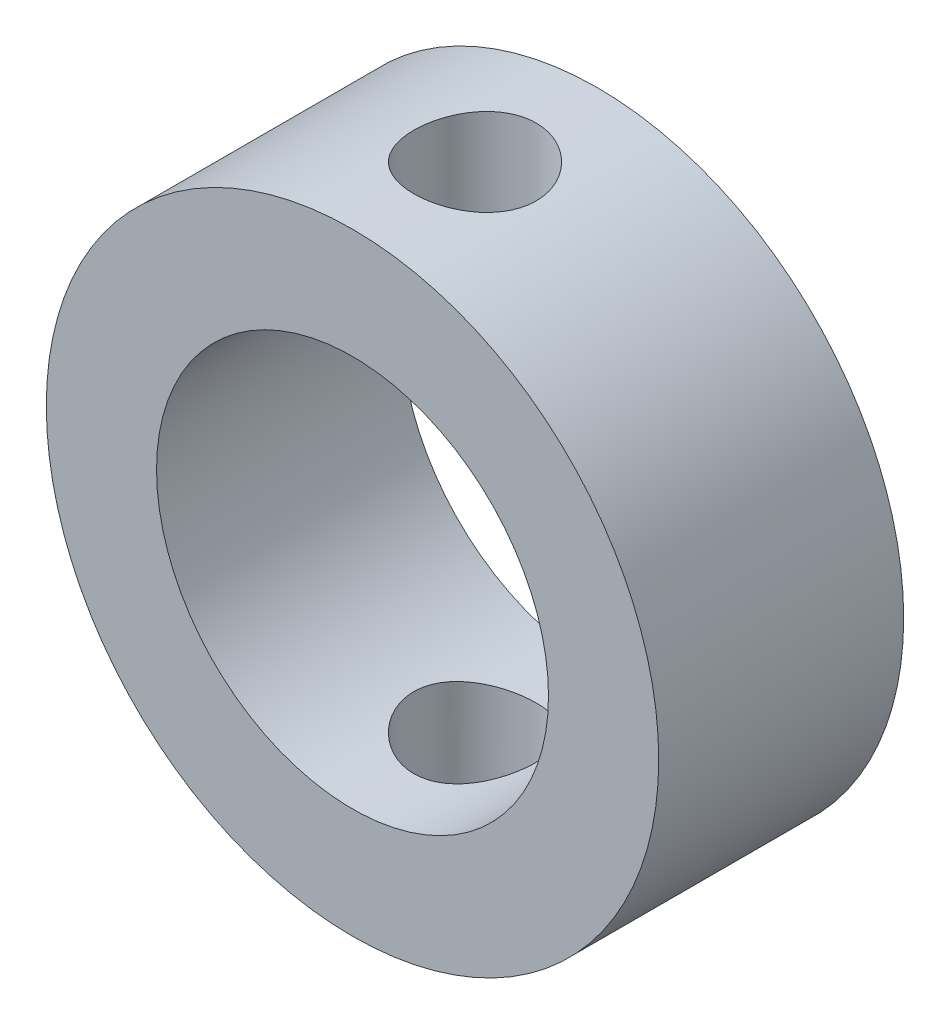
ISO-10303-21;
HEADER;
FILE_DESCRIPTION(('STEP AP214'),'2;1');
FILE_NAME('part.step','',(''),(''),'','','');
FILE_SCHEMA(('AUTOMOTIVE_DESIGN { 1 0 10303 214 1 1 1 1 }'));
ENDSEC;
DATA;
#1=APPLICATION_CONTEXT('core data for automotive mechanical design processes');
#2=APPLICATION_PROTOCOL_DEFINITION('international standard','automotive_design',2000,#1);
#3=PRODUCT_CONTEXT('',#1,'mechanical');
#4=PRODUCT('Part','Part','',(#3));
#5=PRODUCT_RELATED_PRODUCT_CATEGORY('part','',(#4));
#6=PRODUCT_DEFINITION_FORMATION('','',#4);
#7=PRODUCT_DEFINITION_CONTEXT('part definition',#1,'design');
#8=PRODUCT_DEFINITION('design','',#6,#7);
#9=PRODUCT_DEFINITION_SHAPE('','',#8);
#10=(LENGTH_UNIT() NAMED_UNIT(*) SI_UNIT(.MILLI.,.METRE.));
#11=(NAMED_UNIT(*) PLANE_ANGLE_UNIT() SI_UNIT($,.RADIAN.));
#12=(NAMED_UNIT(*) SI_UNIT($,.STERADIAN.) SOLID_ANGLE_UNIT());
#13=UNCERTAINTY_MEASURE_WITH_UNIT(LENGTH_MEASURE(1.E-05),#10,'distance_accuracy_value','');
#14=(GEOMETRIC_REPRESENTATION_CONTEXT(3) GLOBAL_UNCERTAINTY_ASSIGNED_CONTEXT((#13)) GLOBAL_UNIT_ASSIGNED_CONTEXT((#10,
#11,#12)) REPRESENTATION_CONTEXT('',''));
#15=CARTESIAN_POINT('',(0.,0.,0.));
#16=DIRECTION('',(0.,0.,1.));
#17=DIRECTION('',(1.,0.,0.));
#18=AXIS2_PLACEMENT_3D('',#15,#16,#17);
#19=CARTESIAN_POINT('',(0.,0.,10.));
#20=DIRECTION('',(0.,0.,1.));
#21=DIRECTION('',(1.,0.,0.));
#22=AXIS2_PLACEMENT_3D('',#19,#20,#21);
#23=PLANE('',#22);
#24=CARTESIAN_POINT('',(0.,0.,10.));
#25=DIRECTION('',(0.,0.,1.));
#26=DIRECTION('',(1.,0.,0.));
#27=AXIS2_PLACEMENT_3D('',#24,#25,#26);
#28=CIRCLE('',#27,12.5);
#29=CARTESIAN_POINT('',(12.5,0.,10.));
#30=VERTEX_POINT('',#29);
#31=EDGE_CURVE('E10',#30,#30,#28,.T.);
#32=ORIENTED_EDGE('',*,*,#31,.T.);
#33=EDGE_LOOP('',(#32));
#34=FACE_BOUND('',#33,.T.);
#35=CARTESIAN_POINT('',(0.,0.,10.));
#36=DIRECTION('',(0.,0.,1.));
#37=DIRECTION('',(1.,0.,0.));
#38=AXIS2_PLACEMENT_3D('',#35,#36,#37);
#39=CIRCLE('',#38,8.);
#40=CARTESIAN_POINT('',(8.,0.,10.));
#41=VERTEX_POINT('',#40);
#42=EDGE_CURVE('E50',#41,#41,#39,.T.);
#43=ORIENTED_EDGE('',*,*,#42,.F.);
#44=EDGE_LOOP('',(#43));
#45=FACE_BOUND('',#44,.T.);
#46=ADVANCED_FACE('F31',(#34,#45),#23,.T.);
#47=CARTESIAN_POINT('',(0.,0.,0.));
#48=DIRECTION('',(0.,0.,1.));
#49=DIRECTION('',(1.,0.,0.));
#50=AXIS2_PLACEMENT_3D('',#47,#48,#49);
#51=PLANE('',#50);
#52=CARTESIAN_POINT('',(0.,0.,0.));
#53=DIRECTION('',(0.,0.,1.));
#54=DIRECTION('',(1.,0.,0.));
#55=AXIS2_PLACEMENT_3D('',#52,#53,#54);
#56=CIRCLE('',#55,12.5);
#57=CARTESIAN_POINT('',(12.5,0.,0.));
#58=VERTEX_POINT('',#57);
#59=EDGE_CURVE('E45',#58,#58,#56,.T.);
#60=ORIENTED_EDGE('',*,*,#59,.F.);
#61=EDGE_LOOP('',(#60));
#62=FACE_BOUND('',#61,.T.);
#63=CARTESIAN_POINT('',(0.,0.,0.));
#64=DIRECTION('',(0.,0.,1.));
#65=DIRECTION('',(1.,0.,0.));
#66=AXIS2_PLACEMENT_3D('',#63,#64,#65);
#67=CIRCLE('',#66,8.);
#68=CARTESIAN_POINT('',(8.,0.,0.));
#69=VERTEX_POINT('',#68);
#70=EDGE_CURVE('E53',#69,#69,#67,.T.);
#71=ORIENTED_EDGE('',*,*,#70,.T.);
#72=EDGE_LOOP('',(#71));
#73=FACE_BOUND('',#72,.T.);
#74=ADVANCED_FACE('F89',(#62,#73),#51,.F.);
#75=CARTESIAN_POINT('',(0.,0.,10.));
#76=DIRECTION('',(0.,0.,-1.));
#77=DIRECTION('',(-1.,0.,0.));
#78=AXIS2_PLACEMENT_3D('',#75,#76,#77);
#79=CYLINDRICAL_SURFACE('',#78,12.5);
#80=CARTESIAN_POINT('',(0.,-12.5,7.5));
#81=CARTESIAN_POINT('',(0.138942266981583,-12.4999974395218,7.49999488875414));
#82=CARTESIAN_POINT('',(0.277949150503806,-12.4976596294558,7.48837789258089));
#83=CARTESIAN_POINT('',(0.552033769222549,-12.4885591405808,7.44225374971189));
#84=CARTESIAN_POINT('',(0.68710829385339,-12.4817929465047,7.40772841799623));
#85=CARTESIAN_POINT('',(0.949325763158283,-12.4645912319572,7.31689681594803));
#86=CARTESIAN_POINT('',(1.07647616983284,-12.454159226918,7.26061140788828));
#87=CARTESIAN_POINT('',(1.31951997216056,-12.4307599508829,7.12791938122176));
#88=CARTESIAN_POINT('',(1.43541403768953,-12.4177928308927,7.05151396098199));
#89=CARTESIAN_POINT('',(1.65423369328716,-12.3905541332492,6.87965376427142));
#90=CARTESIAN_POINT('',(1.75698487789631,-12.3762686376087,6.78397911152199));
#91=CARTESIAN_POINT('',(1.94509189152007,-12.3481045113147,6.57676895902074));
#92=CARTESIAN_POINT('',(2.03044636192606,-12.3342259125106,6.4652322216622));
#93=CARTESIAN_POINT('',(2.18207938336905,-12.3083110453154,6.22820951747031));
#94=CARTESIAN_POINT('',(2.24817734716467,-12.2962926841237,6.1026058905091));
#95=CARTESIAN_POINT('',(2.35826416645077,-12.2756567014604,5.8417954524898));
#96=CARTESIAN_POINT('',(2.40225520609309,-12.267038744049,5.70658959163414));
#97=CARTESIAN_POINT('',(2.46631324971207,-12.2543201313051,5.43228909023021));
#98=CARTESIAN_POINT('',(2.48668624489694,-12.2501617526797,5.29326863964444));
#99=CARTESIAN_POINT('',(2.5038803193153,-12.2466593765157,5.01372544658914));
#100=CARTESIAN_POINT('',(2.50070380678375,-12.247314886696,4.87320285919964));
#101=CARTESIAN_POINT('',(2.47113643275455,-12.2533137787046,4.59688302994749));
#102=CARTESIAN_POINT('',(2.44509635060976,-12.2585863214691,4.46104648593171));
#103=CARTESIAN_POINT('',(2.37109471155763,-12.273113654,4.1957098083425));
#104=CARTESIAN_POINT('',(2.3231321077517,-12.2823686339445,4.06620997770248));
#105=CARTESIAN_POINT('',(2.2063119591868,-12.3038904625102,3.816211845741));
#106=CARTESIAN_POINT('',(2.13731537808029,-12.3161772453426,3.69578030107707));
#107=CARTESIAN_POINT('',(1.9804839364317,-12.3423654693265,3.46807287506797));
#108=CARTESIAN_POINT('',(1.89264691089207,-12.3562670959591,3.36079850787211));
#109=CARTESIAN_POINT('',(1.69874983640146,-12.3844255310365,3.16042649385766));
#110=CARTESIAN_POINT('',(1.59239040303111,-12.3986842302726,3.06761858035217));
#111=CARTESIAN_POINT('',(1.36546256015503,-12.4257212178602,2.90111538424694));
#112=CARTESIAN_POINT('',(1.24489396844847,-12.4384994872243,2.82742034676605));
#113=CARTESIAN_POINT('',(0.992648467197303,-12.4611672540222,2.70118122693506));
#114=CARTESIAN_POINT('',(0.860954548963251,-12.4710522212068,2.64867026588866));
#115=CARTESIAN_POINT('',(0.590372441121662,-12.4867852246965,2.56659881490358));
#116=CARTESIAN_POINT('',(0.451485125181124,-12.4926337500133,2.53703554481593));
#117=CARTESIAN_POINT('',(0.172948514067876,-12.4995667966717,2.50210886551431));
#118=CARTESIAN_POINT('',(0.0333508208139413,-12.5007293663117,2.49634895114933));
#119=CARTESIAN_POINT('',(-0.244812335481784,-12.4983762982526,2.50812464735545));
#120=CARTESIAN_POINT('',(-0.383377856109482,-12.4948609235362,2.52565894838149));
#121=CARTESIAN_POINT('',(-0.654264149866352,-12.4835958002004,2.58319593385989));
#122=CARTESIAN_POINT('',(-0.786629870849757,-12.4758844101052,2.62299517124476));
#123=CARTESIAN_POINT('',(-1.04280906874917,-12.4570888015258,2.72370995663952));
#124=CARTESIAN_POINT('',(-1.16662190409385,-12.4460043303557,2.78462708669207));
#125=CARTESIAN_POINT('',(-1.40385293421554,-12.4214977883324,2.92670622662828));
#126=CARTESIAN_POINT('',(-1.51712531688047,-12.4080487609263,3.00810695259736));
#127=CARTESIAN_POINT('',(-1.72854504779802,-12.3803683707471,3.1885229780182));
#128=CARTESIAN_POINT('',(-1.82669077232691,-12.3661369242097,3.28754016599967));
#129=CARTESIAN_POINT('',(-2.00660147693544,-12.3382325889241,3.50218337972781));
#130=CARTESIAN_POINT('',(-2.08809425612164,-12.3245715058326,3.61803936055334));
#131=CARTESIAN_POINT('',(-2.23046355012801,-12.2996047949049,3.8620284033917));
#132=CARTESIAN_POINT('',(-2.29134088980726,-12.2882990728336,3.99016097393388));
#133=CARTESIAN_POINT('',(-2.3903796039549,-12.2694185146096,4.25442061537387));
#134=CARTESIAN_POINT('',(-2.42865874947763,-12.2618243718047,4.3905021030258));
#135=CARTESIAN_POINT('',(-2.48177162906799,-12.2511859198006,4.66733363372726));
#136=CARTESIAN_POINT('',(-2.49660842056278,-12.2481410172778,4.80808306552337));
#137=CARTESIAN_POINT('',(-2.50230227716867,-12.2469787407845,5.08752216136079));
#138=CARTESIAN_POINT('',(-2.49358947017724,-12.2487729797325,5.22620287231752));
#139=CARTESIAN_POINT('',(-2.45338076025015,-12.2568893371153,5.50007912476256));
#140=CARTESIAN_POINT('',(-2.42188504032325,-12.2632114191792,5.63527469423701));
#141=CARTESIAN_POINT('',(-2.33719642124739,-12.279631605479,5.89806927810136));
#142=CARTESIAN_POINT('',(-2.28405626679336,-12.2897205254708,6.02568590125604));
#143=CARTESIAN_POINT('',(-2.15763661150401,-12.3125428743543,6.2702593018361));
#144=CARTESIAN_POINT('',(-2.08435542193721,-12.3252765249724,6.38721518431284));
#145=CARTESIAN_POINT('',(-1.91826478696604,-12.3522240130806,6.60928893037579));
#146=CARTESIAN_POINT('',(-1.82514471808795,-12.3664593227425,6.71417191316899));
#147=CARTESIAN_POINT('',(-1.62266092253285,-12.3946520467989,6.90696551382293));
#148=CARTESIAN_POINT('',(-1.51329346788334,-12.4086093965796,6.99487222579318));
#149=CARTESIAN_POINT('',(-1.28004407272062,-12.4348458096993,7.15208660986612));
#150=CARTESIAN_POINT('',(-1.15602221107459,-12.4471057804812,7.22119000820006));
#151=CARTESIAN_POINT('',(-0.897915902351833,-12.468378127125,7.33746530649148));
#152=CARTESIAN_POINT('',(-0.763840652157817,-12.4773934284654,7.38465697383123));
#153=CARTESIAN_POINT('',(-0.52455372230945,-12.4894093148843,7.44662987011179));
#154=CARTESIAN_POINT('',(-0.420704160034462,-12.4933575789613,7.46660798426939));
#155=CARTESIAN_POINT('',(-0.211248813025167,-12.4986538534973,7.49329478089591));
#156=CARTESIAN_POINT('',(-0.105643084371548,-12.5000019468289,7.50000388627442));
#157=CARTESIAN_POINT('',(0.,-12.5,7.5));
#158=B_SPLINE_CURVE_WITH_KNOTS('',3,(#80,#81,#82,#83,#84,#85,#86,#87,#88,#89,#90,#91,#92,#93,
#94,#95,#96,#97,#98,#99,#100,#101,#102,#103,#104,#105,#106,#107,#108,#109,#110,#111,#112,#113,
#114,#115,#116,#117,#118,#119,#120,#121,#122,#123,#124,#125,#126,#127,#128,#129,#130,#131,#132,
#133,#134,#135,#136,#137,#138,#139,#140,#141,#142,#143,#144,#145,#146,#147,#148,#149,#150,#151,
#152,#153,#154,#155,#156,#157),.UNSPECIFIED.,.T.,.F.,(4,2,2,2,2,2,2,2,2,2,2,2,2,2,2,2,2,2,2,2,2,
2,2,2,2,2,2,2,2,2,2,2,2,2,2,2,2,2,4),(0.,0.416440326653146,0.833211626728308,1.24958433812585,
1.66593225557716,2.08733167528047,2.50876399186841,2.93402987514807,3.35925373412994,
3.77890462758968,4.19851260703063,4.61179317515696,5.02509348134324,5.44118725508981,
5.85732886874176,6.28095631228377,6.7045891884955,7.1288818713506,7.5531231424509,
7.97026839190663,8.38739019144669,8.80076134876808,9.21416348040056,9.63262665083397,
10.0511347086483,10.4760157144806,10.9008797180867,11.3235095258181,11.7460842082604,
12.1609930641925,12.5758985873152,12.9897990313277,13.4037341895467,13.8247019059786,
14.2457663633233,14.6712374168909,15.096323887938,15.4129693822473,15.7296047842749),.UNSPECIFIED.);
#159=CARTESIAN_POINT('',(0.,-12.5,7.5));
#160=VERTEX_POINT('',#159);
#161=EDGE_CURVE('E78',#160,#160,#158,.T.);
#162=ORIENTED_EDGE('',*,*,#161,.T.);
#163=EDGE_LOOP('',(#162));
#164=FACE_BOUND('',#163,.T.);
#165=CARTESIAN_POINT('',(0.,12.5,7.5));
#166=CARTESIAN_POINT('',(-0.138942266981583,12.4999974395218,7.49999488875414));
#167=CARTESIAN_POINT('',(-0.277949150503806,12.4976596294558,7.48837789258089));
#168=CARTESIAN_POINT('',(-0.552033769222549,12.4885591405808,7.44225374971189));
#169=CARTESIAN_POINT('',(-0.68710829385339,12.4817929465047,7.40772841799623));
#170=CARTESIAN_POINT('',(-0.949325763158283,12.4645912319572,7.31689681594803));
#171=CARTESIAN_POINT('',(-1.07647616983284,12.454159226918,7.26061140788828));
#172=CARTESIAN_POINT('',(-1.31951997216056,12.4307599508829,7.12791938122176));
#173=CARTESIAN_POINT('',(-1.43541403768953,12.4177928308927,7.05151396098199));
#174=CARTESIAN_POINT('',(-1.65423369328716,12.3905541332492,6.87965376427142));
#175=CARTESIAN_POINT('',(-1.75698487789631,12.3762686376087,6.78397911152199));
#176=CARTESIAN_POINT('',(-1.94509189152007,12.3481045113147,6.57676895902074));
#177=CARTESIAN_POINT('',(-2.03044636192606,12.3342259125106,6.4652322216622));
#178=CARTESIAN_POINT('',(-2.18207938336905,12.3083110453154,6.22820951747031));
#179=CARTESIAN_POINT('',(-2.24817734716467,12.2962926841237,6.1026058905091));
#180=CARTESIAN_POINT('',(-2.35826416645077,12.2756567014604,5.8417954524898));
#181=CARTESIAN_POINT('',(-2.40225520609309,12.267038744049,5.70658959163414));
#182=CARTESIAN_POINT('',(-2.46631324971207,12.2543201313051,5.43228909023021));
#183=CARTESIAN_POINT('',(-2.48668624489694,12.2501617526797,5.29326863964444));
#184=CARTESIAN_POINT('',(-2.5038803193153,12.2466593765157,5.01372544658914));
#185=CARTESIAN_POINT('',(-2.50070380678375,12.247314886696,4.87320285919964));
#186=CARTESIAN_POINT('',(-2.47113643275455,12.2533137787046,4.59688302994749));
#187=CARTESIAN_POINT('',(-2.44509635060976,12.2585863214691,4.46104648593171));
#188=CARTESIAN_POINT('',(-2.37109471155763,12.273113654,4.1957098083425));
#189=CARTESIAN_POINT('',(-2.3231321077517,12.2823686339445,4.06620997770248));
#190=CARTESIAN_POINT('',(-2.2063119591868,12.3038904625102,3.816211845741));
#191=CARTESIAN_POINT('',(-2.13731537808029,12.3161772453426,3.69578030107707));
#192=CARTESIAN_POINT('',(-1.9804839364317,12.3423654693265,3.46807287506797));
#193=CARTESIAN_POINT('',(-1.89264691089207,12.3562670959591,3.36079850787211));
#194=CARTESIAN_POINT('',(-1.69874983640146,12.3844255310365,3.16042649385766));
#195=CARTESIAN_POINT('',(-1.59239040303111,12.3986842302726,3.06761858035217));
#196=CARTESIAN_POINT('',(-1.36546256015503,12.4257212178602,2.90111538424694));
#197=CARTESIAN_POINT('',(-1.24489396844847,12.4384994872243,2.82742034676605));
#198=CARTESIAN_POINT('',(-0.992648467197303,12.4611672540222,2.70118122693506));
#199=CARTESIAN_POINT('',(-0.860954548963251,12.4710522212068,2.64867026588866));
#200=CARTESIAN_POINT('',(-0.590372441121662,12.4867852246965,2.56659881490358));
#201=CARTESIAN_POINT('',(-0.451485125181124,12.4926337500133,2.53703554481593));
#202=CARTESIAN_POINT('',(-0.172948514067876,12.4995667966717,2.50210886551431));
#203=CARTESIAN_POINT('',(-0.0333508208139413,12.5007293663117,2.49634895114933));
#204=CARTESIAN_POINT('',(0.244812335481784,12.4983762982526,2.50812464735545));
#205=CARTESIAN_POINT('',(0.383377856109482,12.4948609235362,2.52565894838149));
#206=CARTESIAN_POINT('',(0.654264149866352,12.4835958002004,2.58319593385989));
#207=CARTESIAN_POINT('',(0.786629870849757,12.4758844101052,2.62299517124476));
#208=CARTESIAN_POINT('',(1.04280906874917,12.4570888015258,2.72370995663952));
#209=CARTESIAN_POINT('',(1.16662190409385,12.4460043303557,2.78462708669207));
#210=CARTESIAN_POINT('',(1.40385293421554,12.4214977883324,2.92670622662828));
#211=CARTESIAN_POINT('',(1.51712531688047,12.4080487609263,3.00810695259736));
#212=CARTESIAN_POINT('',(1.72854504779802,12.3803683707471,3.1885229780182));
#213=CARTESIAN_POINT('',(1.82669077232691,12.3661369242097,3.28754016599967));
#214=CARTESIAN_POINT('',(2.00660147693544,12.3382325889241,3.50218337972781));
#215=CARTESIAN_POINT('',(2.08809425612164,12.3245715058326,3.61803936055334));
#216=CARTESIAN_POINT('',(2.23046355012801,12.2996047949049,3.8620284033917));
#217=CARTESIAN_POINT('',(2.29134088980726,12.2882990728336,3.99016097393388));
#218=CARTESIAN_POINT('',(2.3903796039549,12.2694185146096,4.25442061537387));
#219=CARTESIAN_POINT('',(2.42865874947763,12.2618243718047,4.3905021030258));
#220=CARTESIAN_POINT('',(2.48177162906799,12.2511859198006,4.66733363372726));
#221=CARTESIAN_POINT('',(2.49660842056278,12.2481410172778,4.80808306552337));
#222=CARTESIAN_POINT('',(2.50230227716867,12.2469787407845,5.08752216136079));
#223=CARTESIAN_POINT('',(2.49358947017724,12.2487729797325,5.22620287231752));
#224=CARTESIAN_POINT('',(2.45338076025015,12.2568893371153,5.50007912476256));
#225=CARTESIAN_POINT('',(2.42188504032325,12.2632114191792,5.63527469423701));
#226=CARTESIAN_POINT('',(2.33719642124739,12.279631605479,5.89806927810136));
#227=CARTESIAN_POINT('',(2.28405626679336,12.2897205254708,6.02568590125604));
#228=CARTESIAN_POINT('',(2.15763661150401,12.3125428743543,6.2702593018361));
#229=CARTESIAN_POINT('',(2.08435542193721,12.3252765249724,6.38721518431284));
#230=CARTESIAN_POINT('',(1.91826478696604,12.3522240130806,6.60928893037579));
#231=CARTESIAN_POINT('',(1.82514471808795,12.3664593227425,6.71417191316899));
#232=CARTESIAN_POINT('',(1.62266092253285,12.3946520467989,6.90696551382293));
#233=CARTESIAN_POINT('',(1.51329346788334,12.4086093965796,6.99487222579318));
#234=CARTESIAN_POINT('',(1.28004407272062,12.4348458096993,7.15208660986612));
#235=CARTESIAN_POINT('',(1.15602221107459,12.4471057804812,7.22119000820006));
#236=CARTESIAN_POINT('',(0.897915902351833,12.468378127125,7.33746530649148));
#237=CARTESIAN_POINT('',(0.763840652157817,12.4773934284654,7.38465697383123));
#238=CARTESIAN_POINT('',(0.52455372230945,12.4894093148843,7.44662987011179));
#239=CARTESIAN_POINT('',(0.420704160034462,12.4933575789613,7.46660798426939));
#240=CARTESIAN_POINT('',(0.211248813025167,12.4986538534973,7.49329478089591));
#241=CARTESIAN_POINT('',(0.105643084371548,12.5000019468289,7.50000388627442));
#242=CARTESIAN_POINT('',(0.,12.5,7.5));
#243=B_SPLINE_CURVE_WITH_KNOTS('',3,(#165,#166,#167,#168,#169,#170,#171,#172,#173,#174,#175,
#176,#177,#178,#179,#180,#181,#182,#183,#184,#185,#186,#187,#188,#189,#190,#191,#192,#193,#194,
#195,#196,#197,#198,#199,#200,#201,#202,#203,#204,#205,#206,#207,#208,#209,#210,#211,#212,#213,
#214,#215,#216,#217,#218,#219,#220,#221,#222,#223,#224,#225,#226,#227,#228,#229,#230,#231,#232,
#233,#234,#235,#236,#237,#238,#239,#240,#241,#242),.UNSPECIFIED.,.T.,.F.,(4,2,2,2,2,2,2,2,2,2,2,
2,2,2,2,2,2,2,2,2,2,2,2,2,2,2,2,2,2,2,2,2,2,2,2,2,2,2,4),(0.,0.416440326653146,
0.833211626728308,1.24958433812585,1.66593225557716,2.08733167528047,2.50876399186841,
2.93402987514807,3.35925373412994,3.77890462758968,4.19851260703063,4.61179317515696,
5.02509348134324,5.44118725508981,5.85732886874176,6.28095631228377,6.7045891884955,
7.1288818713506,7.5531231424509,7.97026839190663,8.38739019144669,8.80076134876808,
9.21416348040056,9.63262665083397,10.0511347086483,10.4760157144806,10.9008797180867,
11.3235095258181,11.7460842082604,12.1609930641925,12.5758985873152,12.9897990313277,
13.4037341895467,13.8247019059786,14.2457663633233,14.6712374168909,15.096323887938,
15.4129693822473,15.7296047842749),.UNSPECIFIED.);
#244=CARTESIAN_POINT('',(0.,12.5,7.5));
#245=VERTEX_POINT('',#244);
#246=EDGE_CURVE('E73',#245,#245,#243,.T.);
#247=ORIENTED_EDGE('',*,*,#246,.T.);
#248=EDGE_LOOP('',(#247));
#249=FACE_BOUND('',#248,.T.);
#250=ORIENTED_EDGE('',*,*,#31,.F.);
#251=EDGE_LOOP('',(#250));
#252=FACE_BOUND('',#251,.T.);
#253=ORIENTED_EDGE('',*,*,#59,.T.);
#254=EDGE_LOOP('',(#253));
#255=FACE_BOUND('',#254,.T.);
#256=ADVANCED_FACE('F33',(#164,#249,#252,#255),#79,.T.);
#257=CARTESIAN_POINT('',(0.,0.,10.));
#258=DIRECTION('',(0.,0.,-1.));
#259=DIRECTION('',(-1.,0.,0.));
#260=AXIS2_PLACEMENT_3D('',#257,#258,#259);
#261=CYLINDRICAL_SURFACE('',#260,8.);
#262=CARTESIAN_POINT('',(0.,-8.,7.5));
#263=CARTESIAN_POINT('',(0.136878370349093,-7.9999993175598,7.49999910682485));
#264=CARTESIAN_POINT('',(0.273766105005719,-7.99645389969682,7.48872154611109));
#265=CARTESIAN_POINT('',(0.543538419176897,-7.98265788177613,7.44402751692153));
#266=CARTESIAN_POINT('',(0.676422085451815,-7.97240576399719,7.41060603727128));
#267=CARTESIAN_POINT('',(0.934257087301613,-7.94631631395819,7.32286125760852));
#268=CARTESIAN_POINT('',(1.05922035397161,-7.9304876299805,7.26857031069407));
#269=CARTESIAN_POINT('',(1.29826960469292,-7.89487938322185,7.14076536464334));
#270=CARTESIAN_POINT('',(1.41235387088977,-7.8750991979981,7.06724833643883));
#271=CARTESIAN_POINT('',(1.62993066990456,-7.83300427480565,6.90068801596528));
#272=CARTESIAN_POINT('',(1.73304005631332,-7.81063431853978,6.80715822987786));
#273=CARTESIAN_POINT('',(1.92239476407399,-7.76620092748417,6.6042632151729));
#274=CARTESIAN_POINT('',(2.00863694579739,-7.74413755046914,6.49489504501091));
#275=CARTESIAN_POINT('',(2.16388672966227,-7.70222289396344,6.26011087238383));
#276=CARTESIAN_POINT('',(2.23241568300258,-7.68243976603591,6.13436504494556));
#277=CARTESIAN_POINT('',(2.34719482153343,-7.64815603598469,5.87241537003625));
#278=CARTESIAN_POINT('',(2.39345087543889,-7.63365404257377,5.73621428841214));
#279=CARTESIAN_POINT('',(2.46096919860067,-7.61215213969001,5.46154384509588));
#280=CARTESIAN_POINT('',(2.48294220015729,-7.60493945859017,5.32326631272229));
#281=CARTESIAN_POINT('',(2.50349110073976,-7.59820110281901,5.04481376217621));
#282=CARTESIAN_POINT('',(2.50207321991544,-7.59867338454668,4.90463925835668));
#283=CARTESIAN_POINT('',(2.47643649465479,-7.60706378150876,4.63225107946203));
#284=CARTESIAN_POINT('',(2.45312115738766,-7.61468683491897,4.49994174827687));
#285=CARTESIAN_POINT('',(2.38581626711252,-7.63604051304978,4.24121568692531));
#286=CARTESIAN_POINT('',(2.34182451689101,-7.6497717868623,4.1147995845824));
#287=CARTESIAN_POINT('',(2.23377749362554,-7.68202088028593,3.86929611113473));
#288=CARTESIAN_POINT('',(2.16943851324164,-7.70060569321649,3.75034277861603));
#289=CARTESIAN_POINT('',(2.02272041475696,-7.7404371316014,3.52462446424175));
#290=CARTESIAN_POINT('',(1.94033661043155,-7.76168444789102,3.41786265949257));
#291=CARTESIAN_POINT('',(1.75543390836425,-7.80563055600986,3.21445011316602));
#292=CARTESIAN_POINT('',(1.65216914118563,-7.82835139211391,3.11848088444063));
#293=CARTESIAN_POINT('',(1.43072881619106,-7.8718314151916,2.94505621284064));
#294=CARTESIAN_POINT('',(1.31255215469804,-7.89259045676745,2.86760214156158));
#295=CARTESIAN_POINT('',(1.06332922093091,-7.93002589780382,2.73294462279745));
#296=CARTESIAN_POINT('',(0.932189813838559,-7.94666921296415,2.67590372907206));
#297=CARTESIAN_POINT('',(0.661535955565288,-7.97375911657108,2.58489399829687));
#298=CARTESIAN_POINT('',(0.522024061449216,-7.98420758650304,2.55091815552321));
#299=CARTESIAN_POINT('',(0.24437031458069,-7.99742778790027,2.50816391484204));
#300=CARTESIAN_POINT('',(0.106383697577686,-8.00048045790873,2.49846291281295));
#301=CARTESIAN_POINT('',(-0.169260611465172,-7.99939599461967,2.50193245327466));
#302=CARTESIAN_POINT('',(-0.306918348613018,-7.9952599116227,2.51509965464522));
#303=CARTESIAN_POINT('',(-0.574438665951698,-7.98044727539523,2.56319118521277));
#304=CARTESIAN_POINT('',(-0.704409956841874,-7.96993586221374,2.59756653522497));
#305=CARTESIAN_POINT('',(-0.956703857722755,-7.94360242758579,2.68642870473343));
#306=CARTESIAN_POINT('',(-1.07902552089812,-7.92777975028687,2.74091800805002));
#307=CARTESIAN_POINT('',(-1.31586481334438,-7.89197085518848,2.86994643309737));
#308=CARTESIAN_POINT('',(-1.43011947957558,-7.87189253635335,2.94494197499362));
#309=CARTESIAN_POINT('',(-1.64473170192052,-7.82986820006859,3.11230642023485));
#310=CARTESIAN_POINT('',(-1.7450854760879,-7.80792167695774,3.20468003548928));
#311=CARTESIAN_POINT('',(-1.93317492583804,-7.76353989766283,3.4085177801042));
#312=CARTESIAN_POINT('',(-2.02025304679063,-7.74111973412883,3.52059332747845));
#313=CARTESIAN_POINT('',(-2.17442500490303,-7.69923894191212,3.75825323275355));
#314=CARTESIAN_POINT('',(-2.24151915946859,-7.67977826622621,3.88383737605397));
#315=CARTESIAN_POINT('',(-2.35340166961085,-7.64623564661738,4.14469034574095));
#316=CARTESIAN_POINT('',(-2.39827639112025,-7.63213292713749,4.27991929887144));
#317=CARTESIAN_POINT('',(-2.4644578863618,-7.6110234168862,4.55654498649724));
#318=CARTESIAN_POINT('',(-2.48577362827989,-7.60401392602456,4.69793935268707));
#319=CARTESIAN_POINT('',(-2.50358812316251,-7.59816585427753,4.97600817516086));
#320=CARTESIAN_POINT('',(-2.50116559243271,-7.59897209200284,5.11260690769484));
#321=CARTESIAN_POINT('',(-2.47417636257668,-7.60780180751807,5.38334916988388));
#322=CARTESIAN_POINT('',(-2.44961069645024,-7.61582494863208,5.51749281377347));
#323=CARTESIAN_POINT('',(-2.37975459827235,-7.6379362836678,5.77758807918378));
#324=CARTESIAN_POINT('',(-2.33477284812017,-7.65193396380514,5.90363088218672));
#325=CARTESIAN_POINT('',(-2.22560454669999,-7.68439408509128,6.14648082706801));
#326=CARTESIAN_POINT('',(-2.16141408888474,-7.70285743429343,6.26328608415681));
#327=CARTESIAN_POINT('',(-2.01271350026987,-7.74306974067005,6.48929194087963));
#328=CARTESIAN_POINT('',(-1.92750667048265,-7.76491897845913,6.59801625900048));
#329=CARTESIAN_POINT('',(-1.7404179928096,-7.8089799764242,6.799972656224));
#330=CARTESIAN_POINT('',(-1.63853168468878,-7.83119183213309,6.89320057798212));
#331=CARTESIAN_POINT('',(-1.41697332564669,-7.87434543904947,7.06456507672586));
#332=CARTESIAN_POINT('',(-1.29682914897477,-7.89522203461345,7.1421094728999));
#333=CARTESIAN_POINT('',(-1.0445582760273,-7.93253538593756,7.27579783027891));
#334=CARTESIAN_POINT('',(-0.912436315590897,-7.94897388631644,7.33195020428367));
#335=CARTESIAN_POINT('',(-0.651495270747958,-7.97441301466941,7.41718273521693));
#336=CARTESIAN_POINT('',(-0.523340674225093,-7.98392481612283,7.44814973461068));
#337=CARTESIAN_POINT('',(-0.263459790880496,-7.99671800680967,7.48955671993543));
#338=CARTESIAN_POINT('',(-0.13173423227935,-8.00000065679286,7.50000085960801));
#339=CARTESIAN_POINT('',(0.,-8.,7.5));
#340=B_SPLINE_CURVE_WITH_KNOTS('',3,(#262,#263,#264,#265,#266,#267,#268,#269,#270,#271,#272,
#273,#274,#275,#276,#277,#278,#279,#280,#281,#282,#283,#284,#285,#286,#287,#288,#289,#290,#291,
#292,#293,#294,#295,#296,#297,#298,#299,#300,#301,#302,#303,#304,#305,#306,#307,#308,#309,#310,
#311,#312,#313,#314,#315,#316,#317,#318,#319,#320,#321,#322,#323,#324,#325,#326,#327,#328,#329,
#330,#331,#332,#333,#334,#335,#336,#337,#338,#339),.UNSPECIFIED.,.T.,.F.,(4,2,2,2,2,2,2,2,2,2,2,
2,2,2,2,2,2,2,2,2,2,2,2,2,2,2,2,2,2,2,2,2,2,2,2,2,2,2,4),(0.,0.41015089886502,0.820394646698133,
1.23000495840487,1.63967984311678,2.06075644390317,2.48191134862552,2.91347542494988,
3.34492572559054,3.7633830033442,4.18172900590277,4.58353834844338,4.98539039958126,
5.39311285441091,5.80094132020717,6.227334945592,6.65376014826607,7.08350921379541,
7.51312768989108,7.92615137096475,8.33911471298726,8.74181253445744,9.14456010069,
9.55712649476687,9.96980491418519,10.3988355742628,10.8278594196742,11.2552023150671,
11.6823824779468,12.0902440696666,12.4980866352126,12.8999582681244,13.3019116867944,
13.7195902803182,14.1373807476578,14.5688133627192,15.0000761335177,15.3948927332218,
15.7896294154519),.UNSPECIFIED.);
#341=CARTESIAN_POINT('',(0.,-8.,7.5));
#342=VERTEX_POINT('',#341);
#343=EDGE_CURVE('E36',#342,#342,#340,.T.);
#344=ORIENTED_EDGE('',*,*,#343,.F.);
#345=EDGE_LOOP('',(#344));
#346=FACE_BOUND('',#345,.T.);
#347=CARTESIAN_POINT('',(0.,8.,7.5));
#348=CARTESIAN_POINT('',(-0.136878370349093,7.9999993175598,7.49999910682485));
#349=CARTESIAN_POINT('',(-0.273766105005719,7.99645389969682,7.48872154611109));
#350=CARTESIAN_POINT('',(-0.543538419176897,7.98265788177613,7.44402751692153));
#351=CARTESIAN_POINT('',(-0.676422085451815,7.97240576399719,7.41060603727128));
#352=CARTESIAN_POINT('',(-0.934257087301613,7.94631631395819,7.32286125760852));
#353=CARTESIAN_POINT('',(-1.05922035397161,7.9304876299805,7.26857031069407));
#354=CARTESIAN_POINT('',(-1.29826960469292,7.89487938322185,7.14076536464334));
#355=CARTESIAN_POINT('',(-1.41235387088977,7.8750991979981,7.06724833643883));
#356=CARTESIAN_POINT('',(-1.62993066990456,7.83300427480565,6.90068801596528));
#357=CARTESIAN_POINT('',(-1.73304005631332,7.81063431853978,6.80715822987786));
#358=CARTESIAN_POINT('',(-1.92239476407399,7.76620092748417,6.6042632151729));
#359=CARTESIAN_POINT('',(-2.00863694579739,7.74413755046914,6.49489504501091));
#360=CARTESIAN_POINT('',(-2.16388672966227,7.70222289396344,6.26011087238383));
#361=CARTESIAN_POINT('',(-2.23241568300258,7.68243976603591,6.13436504494556));
#362=CARTESIAN_POINT('',(-2.34719482153343,7.64815603598469,5.87241537003625));
#363=CARTESIAN_POINT('',(-2.39345087543889,7.63365404257377,5.73621428841214));
#364=CARTESIAN_POINT('',(-2.46096919860067,7.61215213969001,5.46154384509588));
#365=CARTESIAN_POINT('',(-2.48294220015729,7.60493945859017,5.32326631272229));
#366=CARTESIAN_POINT('',(-2.50349110073976,7.59820110281901,5.04481376217621));
#367=CARTESIAN_POINT('',(-2.50207321991544,7.59867338454668,4.90463925835668));
#368=CARTESIAN_POINT('',(-2.47643649465479,7.60706378150876,4.63225107946203));
#369=CARTESIAN_POINT('',(-2.45312115738766,7.61468683491897,4.49994174827687));
#370=CARTESIAN_POINT('',(-2.38581626711252,7.63604051304978,4.24121568692531));
#371=CARTESIAN_POINT('',(-2.34182451689101,7.6497717868623,4.1147995845824));
#372=CARTESIAN_POINT('',(-2.23377749362554,7.68202088028593,3.86929611113473));
#373=CARTESIAN_POINT('',(-2.16943851324164,7.70060569321649,3.75034277861603));
#374=CARTESIAN_POINT('',(-2.02272041475696,7.7404371316014,3.52462446424175));
#375=CARTESIAN_POINT('',(-1.94033661043155,7.76168444789102,3.41786265949257));
#376=CARTESIAN_POINT('',(-1.75543390836425,7.80563055600986,3.21445011316602));
#377=CARTESIAN_POINT('',(-1.65216914118563,7.82835139211391,3.11848088444063));
#378=CARTESIAN_POINT('',(-1.43072881619106,7.8718314151916,2.94505621284064));
#379=CARTESIAN_POINT('',(-1.31255215469804,7.89259045676745,2.86760214156158));
#380=CARTESIAN_POINT('',(-1.06332922093091,7.93002589780382,2.73294462279745));
#381=CARTESIAN_POINT('',(-0.932189813838559,7.94666921296415,2.67590372907206));
#382=CARTESIAN_POINT('',(-0.661535955565288,7.97375911657108,2.58489399829687));
#383=CARTESIAN_POINT('',(-0.522024061449216,7.98420758650304,2.55091815552321));
#384=CARTESIAN_POINT('',(-0.24437031458069,7.99742778790027,2.50816391484204));
#385=CARTESIAN_POINT('',(-0.106383697577686,8.00048045790873,2.49846291281295));
#386=CARTESIAN_POINT('',(0.169260611465172,7.99939599461967,2.50193245327466));
#387=CARTESIAN_POINT('',(0.306918348613018,7.9952599116227,2.51509965464522));
#388=CARTESIAN_POINT('',(0.574438665951698,7.98044727539523,2.56319118521277));
#389=CARTESIAN_POINT('',(0.704409956841874,7.96993586221374,2.59756653522497));
#390=CARTESIAN_POINT('',(0.956703857722755,7.94360242758579,2.68642870473343));
#391=CARTESIAN_POINT('',(1.07902552089812,7.92777975028687,2.74091800805002));
#392=CARTESIAN_POINT('',(1.31586481334438,7.89197085518848,2.86994643309737));
#393=CARTESIAN_POINT('',(1.43011947957558,7.87189253635335,2.94494197499362));
#394=CARTESIAN_POINT('',(1.64473170192052,7.82986820006859,3.11230642023485));
#395=CARTESIAN_POINT('',(1.7450854760879,7.80792167695774,3.20468003548928));
#396=CARTESIAN_POINT('',(1.93317492583804,7.76353989766283,3.4085177801042));
#397=CARTESIAN_POINT('',(2.02025304679063,7.74111973412883,3.52059332747845));
#398=CARTESIAN_POINT('',(2.17442500490303,7.69923894191212,3.75825323275355));
#399=CARTESIAN_POINT('',(2.24151915946859,7.67977826622621,3.88383737605397));
#400=CARTESIAN_POINT('',(2.35340166961085,7.64623564661738,4.14469034574095));
#401=CARTESIAN_POINT('',(2.39827639112025,7.63213292713749,4.27991929887144));
#402=CARTESIAN_POINT('',(2.4644578863618,7.6110234168862,4.55654498649724));
#403=CARTESIAN_POINT('',(2.48577362827989,7.60401392602456,4.69793935268707));
#404=CARTESIAN_POINT('',(2.50358812316251,7.59816585427753,4.97600817516086));
#405=CARTESIAN_POINT('',(2.50116559243271,7.59897209200284,5.11260690769484));
#406=CARTESIAN_POINT('',(2.47417636257668,7.60780180751807,5.38334916988388));
#407=CARTESIAN_POINT('',(2.44961069645024,7.61582494863208,5.51749281377347));
#408=CARTESIAN_POINT('',(2.37975459827235,7.6379362836678,5.77758807918378));
#409=CARTESIAN_POINT('',(2.33477284812017,7.65193396380514,5.90363088218672));
#410=CARTESIAN_POINT('',(2.22560454669999,7.68439408509128,6.14648082706801));
#411=CARTESIAN_POINT('',(2.16141408888474,7.70285743429343,6.26328608415681));
#412=CARTESIAN_POINT('',(2.01271350026987,7.74306974067005,6.48929194087963));
#413=CARTESIAN_POINT('',(1.92750667048265,7.76491897845913,6.59801625900048));
#414=CARTESIAN_POINT('',(1.7404179928096,7.8089799764242,6.799972656224));
#415=CARTESIAN_POINT('',(1.63853168468878,7.83119183213309,6.89320057798212));
#416=CARTESIAN_POINT('',(1.41697332564669,7.87434543904947,7.06456507672586));
#417=CARTESIAN_POINT('',(1.29682914897477,7.89522203461345,7.1421094728999));
#418=CARTESIAN_POINT('',(1.0445582760273,7.93253538593756,7.27579783027891));
#419=CARTESIAN_POINT('',(0.912436315590897,7.94897388631644,7.33195020428367));
#420=CARTESIAN_POINT('',(0.651495270747958,7.97441301466941,7.41718273521693));
#421=CARTESIAN_POINT('',(0.523340674225093,7.98392481612283,7.44814973461068));
#422=CARTESIAN_POINT('',(0.263459790880496,7.99671800680967,7.48955671993543));
#423=CARTESIAN_POINT('',(0.13173423227935,8.00000065679286,7.50000085960801));
#424=CARTESIAN_POINT('',(0.,8.,7.5));
#425=B_SPLINE_CURVE_WITH_KNOTS('',3,(#347,#348,#349,#350,#351,#352,#353,#354,#355,#356,#357,
#358,#359,#360,#361,#362,#363,#364,#365,#366,#367,#368,#369,#370,#371,#372,#373,#374,#375,#376,
#377,#378,#379,#380,#381,#382,#383,#384,#385,#386,#387,#388,#389,#390,#391,#392,#393,#394,#395,
#396,#397,#398,#399,#400,#401,#402,#403,#404,#405,#406,#407,#408,#409,#410,#411,#412,#413,#414,
#415,#416,#417,#418,#419,#420,#421,#422,#423,#424),.UNSPECIFIED.,.T.,.F.,(4,2,2,2,2,2,2,2,2,2,2,
2,2,2,2,2,2,2,2,2,2,2,2,2,2,2,2,2,2,2,2,2,2,2,2,2,2,2,4),(0.,0.41015089886502,0.820394646698133,
1.23000495840487,1.63967984311678,2.06075644390317,2.48191134862552,2.91347542494988,
3.34492572559054,3.7633830033442,4.18172900590277,4.58353834844338,4.98539039958126,
5.39311285441091,5.80094132020717,6.227334945592,6.65376014826607,7.08350921379541,
7.51312768989108,7.92615137096475,8.33911471298726,8.74181253445744,9.14456010069,
9.55712649476687,9.96980491418519,10.3988355742628,10.8278594196742,11.2552023150671,
11.6823824779468,12.0902440696666,12.4980866352126,12.8999582681244,13.3019116867944,
13.7195902803182,14.1373807476578,14.5688133627192,15.0000761335177,15.3948927332218,
15.7896294154519),.UNSPECIFIED.);
#426=CARTESIAN_POINT('',(0.,8.,7.5));
#427=VERTEX_POINT('',#426);
#428=EDGE_CURVE('E55',#427,#427,#425,.T.);
#429=ORIENTED_EDGE('',*,*,#428,.F.);
#430=EDGE_LOOP('',(#429));
#431=FACE_BOUND('',#430,.T.);
#432=ORIENTED_EDGE('',*,*,#42,.T.);
#433=EDGE_LOOP('',(#432));
#434=FACE_BOUND('',#433,.T.);
#435=ORIENTED_EDGE('',*,*,#70,.F.);
#436=EDGE_LOOP('',(#435));
#437=FACE_BOUND('',#436,.T.);
#438=ADVANCED_FACE('F60',(#346,#431,#434,#437),#261,.F.);
#439=CARTESIAN_POINT('',(0.,-50.,5.));
#440=DIRECTION('',(0.,1.,0.));
#441=DIRECTION('',(0.,0.,1.));
#442=AXIS2_PLACEMENT_3D('',#439,#440,#441);
#443=CYLINDRICAL_SURFACE('',#442,2.5);
#444=ORIENTED_EDGE('',*,*,#428,.T.);
#445=EDGE_LOOP('',(#444));
#446=FACE_BOUND('',#445,.T.);
#447=ORIENTED_EDGE('',*,*,#246,.F.);
#448=EDGE_LOOP('',(#447));
#449=FACE_BOUND('',#448,.T.);
#450=ADVANCED_FACE('F66',(#446,#449),#443,.F.);
#451=ORIENTED_EDGE('',*,*,#343,.T.);
#452=EDGE_LOOP('',(#451));
#453=FACE_BOUND('',#452,.T.);
#454=ORIENTED_EDGE('',*,*,#161,.F.);
#455=EDGE_LOOP('',(#454));
#456=FACE_BOUND('',#455,.T.);
#457=ADVANCED_FACE('F63',(#453,#456),#443,.F.);
#458=CLOSED_SHELL('',(#46,#74,#256,#438,#450,#457));
#459=MANIFOLD_SOLID_BREP('B2',#458);
#460=ADVANCED_BREP_SHAPE_REPRESENTATION('',(#18,#459),#14);
#461=SHAPE_DEFINITION_REPRESENTATION(#9,#460);
ENDSEC;
END-ISO-10303-21;
